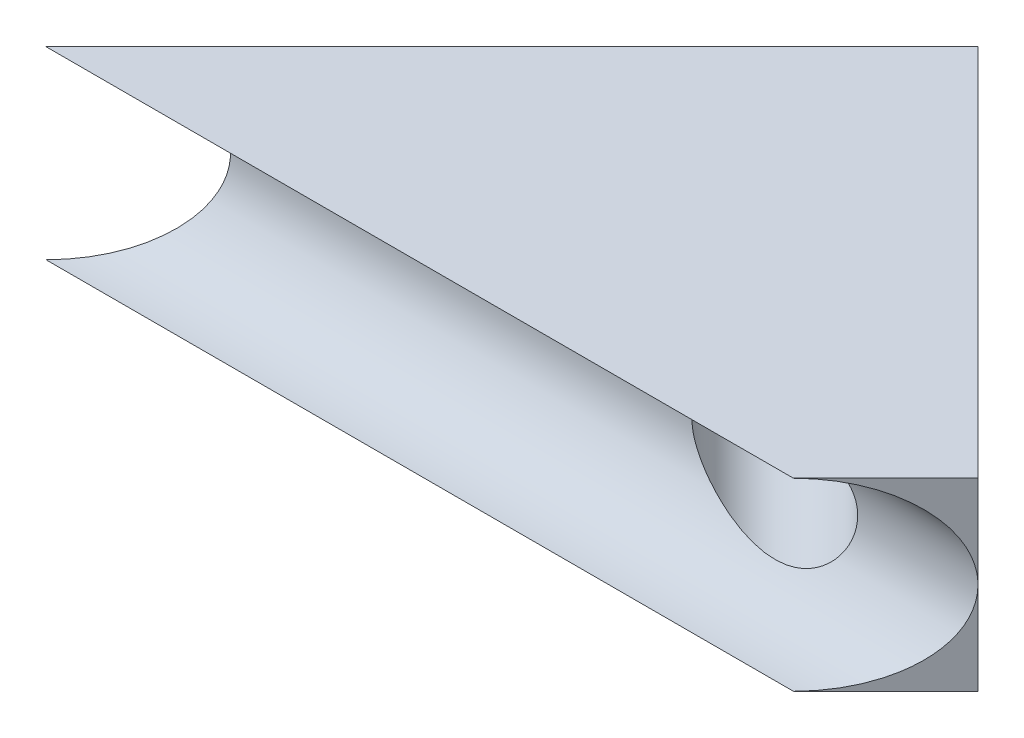
ISO-10303-21;
HEADER;
FILE_DESCRIPTION(('STEP AP214'),'2;1');
FILE_NAME('part.step','',(''),(''),'','','');
FILE_SCHEMA(('AUTOMOTIVE_DESIGN { 1 0 10303 214 1 1 1 1 }'));
ENDSEC;
DATA;
#1=APPLICATION_CONTEXT('core data for automotive mechanical design processes');
#2=APPLICATION_PROTOCOL_DEFINITION('international standard','automotive_design',2000,#1);
#3=PRODUCT_CONTEXT('',#1,'mechanical');
#4=PRODUCT('Part','Part','',(#3));
#5=PRODUCT_RELATED_PRODUCT_CATEGORY('part','',(#4));
#6=PRODUCT_DEFINITION_FORMATION('','',#4);
#7=PRODUCT_DEFINITION_CONTEXT('part definition',#1,'design');
#8=PRODUCT_DEFINITION('design','',#6,#7);
#9=PRODUCT_DEFINITION_SHAPE('','',#8);
#10=(LENGTH_UNIT() NAMED_UNIT(*) SI_UNIT(.MILLI.,.METRE.));
#11=(NAMED_UNIT(*) PLANE_ANGLE_UNIT() SI_UNIT($,.RADIAN.));
#12=(NAMED_UNIT(*) SI_UNIT($,.STERADIAN.) SOLID_ANGLE_UNIT());
#13=UNCERTAINTY_MEASURE_WITH_UNIT(LENGTH_MEASURE(1.E-05),#10,'distance_accuracy_value','');
#14=(GEOMETRIC_REPRESENTATION_CONTEXT(3) GLOBAL_UNCERTAINTY_ASSIGNED_CONTEXT((#13)) GLOBAL_UNIT_ASSIGNED_CONTEXT((#10,
#11,#12)) REPRESENTATION_CONTEXT('',''));
#15=CARTESIAN_POINT('',(0.,0.,0.));
#16=DIRECTION('',(0.,0.,1.));
#17=DIRECTION('',(1.,0.,0.));
#18=AXIS2_PLACEMENT_3D('',#15,#16,#17);
#19=CARTESIAN_POINT('',(0.,70.,0.));
#20=DIRECTION('',(0.707106781186549,0.,0.707106781186546));
#21=DIRECTION('',(0.707106781186546,0.,-0.707106781186549));
#22=AXIS2_PLACEMENT_3D('',#19,#20,#21);
#23=PLANE('',#22);
#24=CARTESIAN_POINT('',(138.244525971888,35.,-138.244525971888));
#25=DIRECTION('',(-0.707106781186549,0.,-0.707106781186546));
#26=DIRECTION('',(-0.707106781186546,0.,0.707106781186549));
#27=AXIS2_PLACEMENT_3D('',#24,#25,#26);
#28=CIRCLE('',#27,22.2312266062723);
#29=CARTESIAN_POINT('',(122.524674884498,35.,-122.524674884498));
#30=VERTEX_POINT('',#29);
#31=EDGE_CURVE('E128',#30,#30,#28,.T.);
#32=ORIENTED_EDGE('',*,*,#31,.F.);
#33=EDGE_LOOP('',(#32));
#34=FACE_BOUND('',#33,.T.);
#35=CARTESIAN_POINT('',(0.,35.,0.));
#36=DIRECTION('',(0.707106781186549,0.,0.707106781186546));
#37=DIRECTION('',(-0.707106781186546,0.,0.707106781186549));
#38=AXIS2_PLACEMENT_3D('',#35,#36,#37);
#39=ELLIPSE('',#38,49.4974746830582,35.);
#40=CARTESIAN_POINT('',(0.,70.,0.));
#41=VERTEX_POINT('',#40);
#42=CARTESIAN_POINT('',(0.,0.,0.));
#43=VERTEX_POINT('',#42);
#44=EDGE_CURVE('E79',#41,#43,#39,.F.);
#45=ORIENTED_EDGE('',*,*,#44,.F.);
#46=DIRECTION('',(-0.707106781186546,0.,0.707106781186549));
#47=VECTOR('',#46,1.);
#48=CARTESIAN_POINT('',(0.,70.,0.));
#49=LINE('',#48,#47);
#50=CARTESIAN_POINT('',(176.776695296637,70.,-176.776695296637));
#51=VERTEX_POINT('',#50);
#52=EDGE_CURVE('E113',#51,#41,#49,.T.);
#53=ORIENTED_EDGE('',*,*,#52,.F.);
#54=DIRECTION('',(0.,-1.,0.));
#55=VECTOR('',#54,1.);
#56=CARTESIAN_POINT('',(176.776695296637,70.,-176.776695296637));
#57=LINE('',#56,#55);
#58=CARTESIAN_POINT('',(176.776695296637,0.,-176.776695296637));
#59=VERTEX_POINT('',#58);
#60=EDGE_CURVE('E101',#51,#59,#57,.T.);
#61=ORIENTED_EDGE('',*,*,#60,.T.);
#62=DIRECTION('',(-0.707106781186546,0.,0.707106781186549));
#63=VECTOR('',#62,1.);
#64=CARTESIAN_POINT('',(0.,0.,0.));
#65=LINE('',#64,#63);
#66=EDGE_CURVE('E111',#59,#43,#65,.T.);
#67=ORIENTED_EDGE('',*,*,#66,.T.);
#68=EDGE_LOOP('',(#45,#53,#61,#67));
#69=FACE_BOUND('',#68,.T.);
#70=ADVANCED_FACE('F39',(#34,#69),#23,.F.);
#71=CARTESIAN_POINT('',(176.776695296637,70.,-176.776695296637));
#72=DIRECTION('',(-0.707106781186549,0.,0.707106781186547));
#73=DIRECTION('',(0.707106781186546,0.,0.707106781186549));
#74=AXIS2_PLACEMENT_3D('',#71,#72,#73);
#75=PLANE('',#74);
#76=DIRECTION('',(-0.707106781186547,0.,-0.707106781186549));
#77=VECTOR('',#76,1.);
#78=CARTESIAN_POINT('',(176.776695296637,70.,-176.776695296637));
#79=LINE('',#78,#77);
#80=CARTESIAN_POINT('',(318.553390593273,70.,-35.));
#81=VERTEX_POINT('',#80);
#82=EDGE_CURVE('E66',#81,#51,#79,.T.);
#83=ORIENTED_EDGE('',*,*,#82,.F.);
#84=DIRECTION('',(0.,-1.,0.));
#85=VECTOR('',#84,1.);
#86=CARTESIAN_POINT('',(318.553390593273,164.,-35.));
#87=LINE('',#86,#85);
#88=CARTESIAN_POINT('',(318.553390593273,35.,-35.));
#89=VERTEX_POINT('',#88);
#90=EDGE_CURVE('E86',#81,#89,#87,.T.);
#91=ORIENTED_EDGE('',*,*,#90,.T.);
#92=CARTESIAN_POINT('',(318.553390593273,0.,-35.));
#93=VERTEX_POINT('',#92);
#94=EDGE_CURVE('E100',#89,#93,#87,.T.);
#95=ORIENTED_EDGE('',*,*,#94,.T.);
#96=DIRECTION('',(-0.707106781186547,0.,-0.707106781186549));
#97=VECTOR('',#96,1.);
#98=CARTESIAN_POINT('',(176.776695296637,0.,-176.776695296637));
#99=LINE('',#98,#97);
#100=EDGE_CURVE('E108',#93,#59,#99,.T.);
#101=ORIENTED_EDGE('',*,*,#100,.T.);
#102=ORIENTED_EDGE('',*,*,#60,.F.);
#103=EDGE_LOOP('',(#83,#91,#95,#101,#102));
#104=FACE_BOUND('',#103,.T.);
#105=ADVANCED_FACE('F150',(#104),#75,.F.);
#106=CARTESIAN_POINT('',(0.,70.,0.));
#107=DIRECTION('',(0.,-1.,0.));
#108=DIRECTION('',(0.,0.,-1.));
#109=AXIS2_PLACEMENT_3D('',#106,#107,#108);
#110=PLANE('',#109);
#111=DIRECTION('',(1.,0.,0.));
#112=VECTOR('',#111,1.);
#113=CARTESIAN_POINT('',(0.,70.,0.));
#114=LINE('',#113,#112);
#115=CARTESIAN_POINT('',(283.553390593273,70.,0.));
#116=VERTEX_POINT('',#115);
#117=EDGE_CURVE('E83',#41,#116,#114,.T.);
#118=ORIENTED_EDGE('',*,*,#117,.T.);
#119=DIRECTION('',(0.707106781186548,0.,-0.707106781186547));
#120=VECTOR('',#119,1.);
#121=CARTESIAN_POINT('',(141.776695296636,70.,141.776695296637));
#122=LINE('',#121,#120);
#123=EDGE_CURVE('E125',#116,#81,#122,.T.);
#124=ORIENTED_EDGE('',*,*,#123,.T.);
#125=ORIENTED_EDGE('',*,*,#82,.T.);
#126=ORIENTED_EDGE('',*,*,#52,.T.);
#127=EDGE_LOOP('',(#118,#124,#125,#126));
#128=FACE_BOUND('',#127,.T.);
#129=ADVANCED_FACE('F146',(#128),#110,.F.);
#130=CARTESIAN_POINT('',(0.,0.,0.));
#131=DIRECTION('',(0.,-1.,0.));
#132=DIRECTION('',(0.,0.,-1.));
#133=AXIS2_PLACEMENT_3D('',#130,#131,#132);
#134=PLANE('',#133);
#135=DIRECTION('',(0.707106781186548,0.,-0.707106781186547));
#136=VECTOR('',#135,1.);
#137=CARTESIAN_POINT('',(318.553390593273,0.,-35.));
#138=LINE('',#137,#136);
#139=CARTESIAN_POINT('',(283.553390593273,0.,0.));
#140=VERTEX_POINT('',#139);
#141=EDGE_CURVE('E98',#140,#93,#138,.T.);
#142=ORIENTED_EDGE('',*,*,#141,.F.);
#143=DIRECTION('',(1.,0.,0.));
#144=VECTOR('',#143,1.);
#145=CARTESIAN_POINT('',(0.,0.,0.));
#146=LINE('',#145,#144);
#147=EDGE_CURVE('E106',#43,#140,#146,.T.);
#148=ORIENTED_EDGE('',*,*,#147,.F.);
#149=ORIENTED_EDGE('',*,*,#66,.F.);
#150=ORIENTED_EDGE('',*,*,#100,.F.);
#151=EDGE_LOOP('',(#142,#148,#149,#150));
#152=FACE_BOUND('',#151,.T.);
#153=ADVANCED_FACE('F104',(#152),#134,.T.);
#154=CARTESIAN_POINT('',(402.,35.,0.));
#155=DIRECTION('',(-1.,0.,0.));
#156=DIRECTION('',(0.,0.,1.));
#157=AXIS2_PLACEMENT_3D('',#154,#155,#156);
#158=CYLINDRICAL_SURFACE('',#157,35.);
#159=CARTESIAN_POINT('',(210.049349768997,35.,-35.));
#160=CARTESIAN_POINT('',(210.049350373867,34.6833696475659,-34.9999998020079));
#161=CARTESIAN_POINT('',(210.0632473887,34.3667348472351,-34.9956918297285));
#162=CARTESIAN_POINT('',(210.118431080023,33.7361113067099,-34.9785949282316));
#163=CARTESIAN_POINT('',(210.159717979462,33.4221225880751,-34.9658059299802));
#164=CARTESIAN_POINT('',(210.268576301915,32.7989466943214,-34.932117377598));
#165=CARTESIAN_POINT('',(210.336168620323,32.489763539992,-34.9112113758539));
#166=CARTESIAN_POINT('',(210.495900684337,31.8784423759471,-34.8618700768882));
#167=CARTESIAN_POINT('',(210.588043430153,31.5763052322081,-34.8334338594309));
#168=CARTESIAN_POINT('',(210.820446728159,30.9067052753023,-34.7618271671585));
#169=CARTESIAN_POINT('',(210.96697303938,30.541613562391,-34.7167516184364));
#170=CARTESIAN_POINT('',(211.290621474194,29.8266793146231,-34.6174406534621));
#171=CARTESIAN_POINT('',(211.467751875478,29.4768409375814,-34.5632027590981));
#172=CARTESIAN_POINT('',(212.039255897943,28.4504042761568,-34.3887325843824));
#173=CARTESIAN_POINT('',(212.473475989442,27.7976088767799,-34.2568263893907));
#174=CARTESIAN_POINT('',(213.137062029247,26.9254997243817,-34.0568547215995));
#175=CARTESIAN_POINT('',(213.33502622526,26.6788919388131,-33.9973722772679));
#176=CARTESIAN_POINT('',(213.742076696497,26.1957909691787,-33.8754758620562));
#177=CARTESIAN_POINT('',(213.95116034583,25.9592954206697,-33.8130625837044));
#178=CARTESIAN_POINT('',(214.593304488913,25.2641096200319,-33.622074062538));
#179=CARTESIAN_POINT('',(215.041062845545,24.8199724498888,-33.4898091423661));
#180=CARTESIAN_POINT('',(215.967695395283,23.9665026773153,-33.2184089624481));
#181=CARTESIAN_POINT('',(216.446619361865,23.5572282850803,-33.0792628024185));
#182=CARTESIAN_POINT('',(217.428966122617,22.7706121955723,-32.7965966893681));
#183=CARTESIAN_POINT('',(217.932397993225,22.3932824728243,-32.6530751233959));
#184=CARTESIAN_POINT('',(218.94381195653,21.6783960400617,-32.3678621344342));
#185=CARTESIAN_POINT('',(219.4512198435,21.3399934470485,-32.2262419829456));
#186=CARTESIAN_POINT('',(220.481429652917,20.6881681753811,-31.9421011295509));
#187=CARTESIAN_POINT('',(221.004229446627,20.3747420644392,-31.799580554297));
#188=CARTESIAN_POINT('',(222.063399680441,19.7705148129749,-31.5146699200237));
#189=CARTESIAN_POINT('',(222.599782036479,19.479734519947,-31.3722800977823));
#190=CARTESIAN_POINT('',(223.683858453336,18.9194173710235,-31.0887989738743));
#191=CARTESIAN_POINT('',(224.231552860642,18.6498811670519,-30.9477077121743));
#192=CARTESIAN_POINT('',(225.338596478426,18.1298518984126,-30.6673380605586));
#193=CARTESIAN_POINT('',(225.897977361351,17.8794224948101,-30.528066911765));
#194=CARTESIAN_POINT('',(227.025569869257,17.3974523637755,-30.2527243007438));
#195=CARTESIAN_POINT('',(227.593781374357,17.1659113801887,-30.1166527951422));
#196=CARTESIAN_POINT('',(228.737941362504,16.7209358391713,-29.8486721560645));
#197=CARTESIAN_POINT('',(229.313886717297,16.5074942019816,-29.7167614078612));
#198=CARTESIAN_POINT('',(230.473038260627,16.0979799059214,-29.4579750368998));
#199=CARTESIAN_POINT('',(231.056244539057,15.9019074623343,-29.3310994765612));
#200=CARTESIAN_POINT('',(232.297458357707,15.5049286137122,-29.068972271845));
#201=CARTESIAN_POINT('',(232.956288712625,15.3061041907445,-28.9344585036048));
#202=CARTESIAN_POINT('',(234.281641796318,14.9292966205421,-28.6743659191323));
#203=CARTESIAN_POINT('',(234.948164667665,14.7513138602657,-28.5487872688116));
#204=CARTESIAN_POINT('',(236.288695117439,14.4161723810039,-28.3081016730716));
#205=CARTESIAN_POINT('',(236.962706468064,14.2590247256049,-28.1930003012472));
#206=CARTESIAN_POINT('',(238.317335411199,13.9660925585285,-27.9751327822448));
#207=CARTESIAN_POINT('',(238.997952880478,13.8303076491606,-27.872366405446));
#208=CARTESIAN_POINT('',(240.362449605077,13.5814313574066,-27.6815715822662));
#209=CARTESIAN_POINT('',(241.046303913982,13.4682488925817,-27.5934842308508));
#210=CARTESIAN_POINT('',(242.419446445784,13.2651269694637,-27.4337747934368));
#211=CARTESIAN_POINT('',(243.108735019334,13.1751890239112,-27.3621537790918));
#212=CARTESIAN_POINT('',(244.491238373136,13.0203935938958,-27.2379654311798));
#213=CARTESIAN_POINT('',(245.184449032559,12.9555134705058,-27.1853809014731));
#214=CARTESIAN_POINT('',(246.574100859354,12.8530607071221,-27.1019830407875));
#215=CARTESIAN_POINT('',(247.270541277108,12.8154820213127,-27.0711648897562));
#216=CARTESIAN_POINT('',(248.645018008801,12.7712384577199,-27.0348477222514));
#217=CARTESIAN_POINT('',(249.323005988648,12.7637134834727,-27.0286443001049));
#218=CARTESIAN_POINT('',(250.678350432577,12.780568225541,-27.0425043031947));
#219=CARTESIAN_POINT('',(251.35570694959,12.8049449707093,-27.0625652823119));
#220=CARTESIAN_POINT('',(252.70652611344,12.889537436026,-27.131725106329));
#221=CARTESIAN_POINT('',(253.379990257024,12.9497383062613,-27.1808119193085));
#222=CARTESIAN_POINT('',(254.719204883765,13.1103945919227,-27.3103624035973));
#223=CARTESIAN_POINT('',(255.384955222855,13.2108507579321,-27.3908266599565));
#224=CARTESIAN_POINT('',(256.712569625724,13.4583397733699,-27.5859043960254));
#225=CARTESIAN_POINT('',(257.374252068516,13.6059986169674,-27.7009755365298));
#226=CARTESIAN_POINT('',(258.677506958123,13.951950734466,-27.9647440483084));
#227=CARTESIAN_POINT('',(259.319080136186,14.1502421647705,-28.113440195231));
#228=CARTESIAN_POINT('',(260.573936003996,14.6007491108714,-28.4420129424141));
#229=CARTESIAN_POINT('',(261.187251330726,14.8529004204068,-28.6218523689336));
#230=CARTESIAN_POINT('',(262.378901948119,15.4132377446058,-29.008176468058));
#231=CARTESIAN_POINT('',(262.957242654088,15.7214150547128,-29.2146570000863));
#232=CARTESIAN_POINT('',(263.998126399863,16.3490157460599,-29.6185875460773));
#233=CARTESIAN_POINT('',(264.465836410385,16.6614826277785,-29.8135815449537));
#234=CARTESIAN_POINT('',(265.366727289527,17.3273835455543,-30.2130645429449));
#235=CARTESIAN_POINT('',(265.799910784512,17.6808144605287,-30.4175528179723));
#236=CARTESIAN_POINT('',(266.62958825831,18.4268150180143,-30.8303632315601));
#237=CARTESIAN_POINT('',(267.02606233175,18.8194056576615,-31.0386873775414));
#238=CARTESIAN_POINT('',(267.780619186346,19.6408638715716,-31.4532753205129));
#239=CARTESIAN_POINT('',(268.138701924299,20.0697314866561,-31.6595391151845));
#240=CARTESIAN_POINT('',(268.794847390966,20.9330250005614,-32.0520043906438));
#241=CARTESIAN_POINT('',(269.095251193243,21.3654715244197,-32.2386581437666));
#242=CARTESIAN_POINT('',(269.661506544145,22.2566416521582,-32.6011990949323));
#243=CARTESIAN_POINT('',(269.927360216772,22.7153636382296,-32.7770869544667));
#244=CARTESIAN_POINT('',(270.424641090862,23.6561097813981,-33.1144355020825));
#245=CARTESIAN_POINT('',(270.656070826409,24.1381322197908,-33.275897251778));
#246=CARTESIAN_POINT('',(271.084812730781,25.122498659848,-33.5812532146729));
#247=CARTESIAN_POINT('',(271.282122985449,25.6248437996994,-33.7251464421168));
#248=CARTESIAN_POINT('',(271.655303254382,26.6817760991256,-34.0018466933105));
#249=CARTESIAN_POINT('',(271.828780330286,27.2375852368121,-34.1332201121698));
#250=CARTESIAN_POINT('',(272.137539246383,28.3650848794777,-34.3701877754906));
#251=CARTESIAN_POINT('',(272.272819679726,28.9367759685658,-34.4757810704051));
#252=CARTESIAN_POINT('',(272.505545059727,30.0923239402187,-34.6591547522381));
#253=CARTESIAN_POINT('',(272.602981834814,30.6761834216559,-34.7369291319392));
#254=CARTESIAN_POINT('',(272.760233707995,31.8520790378631,-34.8631652510926));
#255=CARTESIAN_POINT('',(272.820048325164,32.4441152770579,-34.9116266158362));
#256=CARTESIAN_POINT('',(272.903695548342,33.6538908469834,-34.9795380599531));
#257=CARTESIAN_POINT('',(272.926154822561,34.2717880168929,-34.9978805563332));
#258=CARTESIAN_POINT('',(272.930928007122,35.5078515605528,-35.0017725948474));
#259=CARTESIAN_POINT('',(272.913240817866,36.1260179412133,-34.987321238769));
#260=CARTESIAN_POINT('',(272.837664566778,37.3583238377715,-34.925906138952));
#261=CARTESIAN_POINT('',(272.779771880822,37.9724629856165,-34.8789394642839));
#262=CARTESIAN_POINT('',(272.623613935815,39.1923230786641,-34.753422556928));
#263=CARTESIAN_POINT('',(272.525348800756,39.7980440497151,-34.6748724212408));
#264=CARTESIAN_POINT('',(272.287529956143,40.999992108236,-34.4872734794217));
#265=CARTESIAN_POINT('',(272.147757141969,41.5961506594733,-34.3780629994204));
#266=CARTESIAN_POINT('',(271.826740488161,42.7712787310921,-34.131622248047));
#267=CARTESIAN_POINT('',(271.645496207719,43.3502480686925,-33.9943916788459));
#268=CARTESIAN_POINT('',(271.241067165873,44.4867610374767,-33.6949066361897));
#269=CARTESIAN_POINT('',(271.017877603631,45.0443022072971,-33.5326492986827));
#270=CARTESIAN_POINT('',(270.529121283667,46.1336368182042,-33.1868748200704));
#271=CARTESIAN_POINT('',(270.263555285213,46.6654307203869,-33.0033580598904));
#272=CARTESIAN_POINT('',(269.694010776572,47.6913359416001,-32.6224599211239));
#273=CARTESIAN_POINT('',(269.390669391356,48.185893400468,-32.4253282980175));
#274=CARTESIAN_POINT('',(268.742450094277,49.1421295423494,-32.0198356946149));
#275=CARTESIAN_POINT('',(268.397572486817,49.6038084662782,-31.8114747966201));
#276=CARTESIAN_POINT('',(267.666947234361,50.4902978913054,-31.3893540160427));
#277=CARTESIAN_POINT('',(267.281231545522,50.9151367533893,-31.1755984531487));
#278=CARTESIAN_POINT('',(266.469815124136,51.7250718031545,-30.7486842267437));
#279=CARTESIAN_POINT('',(266.04411735621,52.1101709330505,-30.5355255201815));
#280=CARTESIAN_POINT('',(265.181250080118,52.816353325792,-30.128619666725));
#281=CARTESIAN_POINT('',(264.746268597917,53.1398817111791,-29.9344720120887));
#282=CARTESIAN_POINT('',(263.845341826349,53.7479947984659,-29.557414549613));
#283=CARTESIAN_POINT('',(263.379398304519,54.0325817205926,-29.3745041014182));
#284=CARTESIAN_POINT('',(262.420043966279,54.5621629755466,-29.0245171387066));
#285=CARTESIAN_POINT('',(261.926638634765,54.8071651766759,-28.8574374802224));
#286=CARTESIAN_POINT('',(260.916322282248,55.2580117438007,-28.5427506595494));
#287=CARTESIAN_POINT('',(260.39941096666,55.4638556188851,-28.3951437414892));
#288=CARTESIAN_POINT('',(259.364668276087,55.8312196108658,-28.1266823482778));
#289=CARTESIAN_POINT('',(258.847483660719,55.9940236973274,-28.0050807099211));
#290=CARTESIAN_POINT('',(257.799267418638,56.2861658492234,-27.7836777628386));
#291=CARTESIAN_POINT('',(257.268236339339,56.4155052354652,-27.6838755937408));
#292=CARTESIAN_POINT('',(256.195908527911,56.6430219226865,-27.5063702742283));
#293=CARTESIAN_POINT('',(255.654610548092,56.7411954101632,-27.4286698283321));
#294=CARTESIAN_POINT('',(254.564930338125,56.9088770293788,-27.2949190162422));
#295=CARTESIAN_POINT('',(254.016547203107,56.9783814616129,-27.2388714442321));
#296=CARTESIAN_POINT('',(252.996045981255,57.0829665221437,-27.154122174171));
#297=CARTESIAN_POINT('',(252.524511144688,57.1215962709543,-27.1226189572221));
#298=CARTESIAN_POINT('',(251.579548466142,57.1812906860269,-27.0738219524774));
#299=CARTESIAN_POINT('',(251.106120363628,57.2023528449264,-27.0565301930398));
#300=CARTESIAN_POINT('',(250.158292299749,57.2282914743811,-27.0352237576138));
#301=CARTESIAN_POINT('',(249.683891950249,57.2331591497363,-27.0312162963121));
#302=CARTESIAN_POINT('',(248.735265949597,57.2279317932504,-27.03551462171));
#303=CARTESIAN_POINT('',(248.261040293032,57.2178372723967,-27.0438199879032));
#304=CARTESIAN_POINT('',(247.311290904125,57.1837085178223,-27.0718222182128));
#305=CARTESIAN_POINT('',(246.835771028868,57.1596113174357,-27.0915705373752));
#306=CARTESIAN_POINT('',(245.886137202439,57.0983925112214,-27.1415291076225));
#307=CARTESIAN_POINT('',(245.412023249593,57.0612709209238,-27.1717393462328));
#308=CARTESIAN_POINT('',(244.465720117777,56.9748322762365,-27.2416929591906));
#309=CARTESIAN_POINT('',(243.993530570831,56.9255176764139,-27.2814344147666));
#310=CARTESIAN_POINT('',(243.051301116891,56.8153696049135,-27.3695928385478));
#311=CARTESIAN_POINT('',(242.581261332629,56.7545354837841,-27.4180102958834));
#312=CARTESIAN_POINT('',(241.308618874024,56.5745431038931,-27.5601184648994));
#313=CARTESIAN_POINT('',(240.508345802117,56.4447674814923,-27.6614403198276));
#314=CARTESIAN_POINT('',(238.915952195011,56.1551321470651,-27.8835734231869));
#315=CARTESIAN_POINT('',(238.123832856205,55.9952680847159,-28.0043874895289));
#316=CARTESIAN_POINT('',(236.547986762729,55.6465551624384,-28.262463823698));
#317=CARTESIAN_POINT('',(235.764267854753,55.4576813666677,-28.3997402195502));
#318=CARTESIAN_POINT('',(234.206798573318,55.0516017000557,-28.6878940407833));
#319=CARTESIAN_POINT('',(233.433047637443,54.8343974354454,-28.838770694931));
#320=CARTESIAN_POINT('',(231.898619929975,54.3722104311873,-29.1512448259484));
#321=CARTESIAN_POINT('',(231.137911755194,54.1273100600989,-29.3128099498316));
#322=CARTESIAN_POINT('',(229.628363768748,53.6084934329848,-29.6448794108907));
#323=CARTESIAN_POINT('',(228.87952473251,53.3345752900945,-29.8153843290072));
#324=CARTESIAN_POINT('',(227.395971712934,52.756693339643,-30.1631145580123));
#325=CARTESIAN_POINT('',(226.66124477423,52.4527588343468,-30.3403332126955));
#326=CARTESIAN_POINT('',(225.207262917266,51.8127080625555,-30.6996354829828));
#327=CARTESIAN_POINT('',(224.488005070569,51.476597954044,-30.8817181628868));
#328=CARTESIAN_POINT('',(223.245228551572,50.8578947944515,-31.2028255041629));
#329=CARTESIAN_POINT('',(222.717742886524,50.5829392733534,-31.3412303497039));
#330=CARTESIAN_POINT('',(221.67448883539,50.0119402116204,-31.6187041272892));
#331=CARTESIAN_POINT('',(221.158719759939,49.7158979159222,-31.7577730196774));
#332=CARTESIAN_POINT('',(220.140408576588,49.1007181002847,-32.0356642720495));
#333=CARTESIAN_POINT('',(219.637877876054,48.7815614970401,-32.1744863291064));
#334=CARTESIAN_POINT('',(218.649058867536,48.1182905570421,-32.4505704174966));
#335=CARTESIAN_POINT('',(218.162770370714,47.7741765106019,-32.587832466955));
#336=CARTESIAN_POINT('',(217.205377804039,47.0552211552653,-32.8606283644658));
#337=CARTESIAN_POINT('',(216.734457033804,46.6801238197967,-32.9961342639704));
#338=CARTESIAN_POINT('',(215.81712044304,45.8990480882327,-33.2623066778325));
#339=CARTESIAN_POINT('',(215.370710582611,45.4930622380065,-33.3929720126625));
#340=CARTESIAN_POINT('',(214.509714807597,44.6480992584275,-33.6468192617709));
#341=CARTESIAN_POINT('',(214.095063667579,44.2091936227797,-33.7700163992346));
#342=CARTESIAN_POINT('',(213.305128496995,43.2947940207975,-34.0061624318249));
#343=CARTESIAN_POINT('',(212.929814403751,42.8193284837101,-34.1191191439762));
#344=CARTESIAN_POINT('',(212.380000165195,42.0421996988666,-34.2854298261102));
#345=CARTESIAN_POINT('',(212.188462222845,41.7535542034266,-34.3435529445754));
#346=CARTESIAN_POINT('',(211.824280268683,41.1634237225066,-34.4543516838657));
#347=CARTESIAN_POINT('',(211.651639213583,40.8619367379975,-34.5070264521407));
#348=CARTESIAN_POINT('',(211.328263418369,40.2467090884394,-34.6059100222031));
#349=CARTESIAN_POINT('',(211.17750923416,39.9329796178553,-34.6521245618251));
#350=CARTESIAN_POINT('',(210.900811783305,39.2939051997998,-34.7371008025017));
#351=CARTESIAN_POINT('',(210.774855082656,38.9685666550067,-34.7758665386611));
#352=CARTESIAN_POINT('',(210.563878403541,38.3464113212799,-34.8408887763749));
#353=CARTESIAN_POINT('',(210.47578720949,38.0507355251767,-34.8680799456562));
#354=CARTESIAN_POINT('',(210.323150756434,37.4527846882336,-34.9152365796308));
#355=CARTESIAN_POINT('',(210.258603395124,37.1505102391647,-34.9352026894719));
#356=CARTESIAN_POINT('',(210.154669892133,36.5414298929549,-34.9673693527807));
#357=CARTESIAN_POINT('',(210.115267722717,36.2346270101426,-34.9795748529016));
#358=CARTESIAN_POINT('',(210.062607085682,35.6185508679815,-34.9958903599284));
#359=CARTESIAN_POINT('',(210.049349178173,35.3092775558492,-35.0000001933943));
#360=CARTESIAN_POINT('',(210.049349768997,35.,-35.));
#361=B_SPLINE_CURVE_WITH_KNOTS('',3,(#159,#160,#161,#162,#163,#164,#165,#166,#167,#168,#169,
#170,#171,#172,#173,#174,#175,#176,#177,#178,#179,#180,#181,#182,#183,#184,#185,#186,#187,#188,
#189,#190,#191,#192,#193,#194,#195,#196,#197,#198,#199,#200,#201,#202,#203,#204,#205,#206,#207,
#208,#209,#210,#211,#212,#213,#214,#215,#216,#217,#218,#219,#220,#221,#222,#223,#224,#225,#226,
#227,#228,#229,#230,#231,#232,#233,#234,#235,#236,#237,#238,#239,#240,#241,#242,#243,#244,#245,
#246,#247,#248,#249,#250,#251,#252,#253,#254,#255,#256,#257,#258,#259,#260,#261,#262,#263,#264,
#265,#266,#267,#268,#269,#270,#271,#272,#273,#274,#275,#276,#277,#278,#279,#280,#281,#282,#283,
#284,#285,#286,#287,#288,#289,#290,#291,#292,#293,#294,#295,#296,#297,#298,#299,#300,#301,#302,
#303,#304,#305,#306,#307,#308,#309,#310,#311,#312,#313,#314,#315,#316,#317,#318,#319,#320,#321,
#322,#323,#324,#325,#326,#327,#328,#329,#330,#331,#332,#333,#334,#335,#336,#337,#338,#339,#340,
#341,#342,#343,#344,#345,#346,#347,#348,#349,#350,#351,#352,#353,#354,#355,#356,#357,#358,#359,
#360),.UNSPECIFIED.,.T.,.F.,(4,2,2,2,2,2,2,2,2,2,2,2,2,2,2,2,2,2,2,2,2,2,2,2,2,2,2,2,2,2,2,2,2,
2,2,2,2,2,2,2,2,2,2,2,2,2,2,2,2,2,2,2,2,2,2,2,2,2,2,2,2,2,2,2,2,2,2,2,2,2,2,2,2,2,2,2,2,2,2,2,2,
2,2,2,2,2,2,2,2,2,2,2,2,2,2,2,2,2,2,2,4),(0.,0.949569588031101,1.89914690547112,
2.84948005289911,3.79992939013647,4.98596894249319,6.1723297944651,8.54735189725422,
9.51255351439253,10.4775281999947,12.4084471705024,14.3425294481986,16.2773335398179,
18.1549557840555,20.0323195574174,21.9113916689455,23.7905214217257,25.6756610389954,
27.5607750867444,29.4451483167578,31.3295448994642,33.4327339719324,35.5359620872316,
37.6403025961689,39.7446039258909,41.8402462651516,43.9360249533489,46.0299057194564,
48.1233226609397,50.1563801574324,52.1892483198199,54.2212743986254,56.2533383674979,
58.3135546286398,60.3736958853897,62.4313948228296,64.4887743358384,66.2723144650581,
68.0557187941285,69.8400845640716,71.6244523419473,73.2986094373964,74.9726635637318,
76.6465943951714,78.3206191063904,80.109261070936,81.8979689057398,83.6870627613135,
85.4761794864231,87.3297248249396,89.1833209320551,91.0370841440069,92.8908416626412,
94.7545639329931,96.6183060141104,98.4822615394797,100.346183671758,102.182099357828,
104.018001589966,105.852477684104,107.686817861359,109.412062609495,111.137208952691,
112.862011963512,114.586836596023,116.252165911495,117.917429488585,119.582896751173,
121.248578861371,122.670504346794,124.092632744104,125.515533371256,126.938385404765,
128.367685723413,129.796984337788,131.225995454888,132.655087161277,135.105204457026,
137.555676274319,140.008266350443,142.46071743432,144.906057736526,147.351557143349,
149.79469239455,152.237360993342,154.069151098167,155.900833145909,157.734045069689,
159.567235672376,161.417476865937,163.268165991533,165.114946184108,166.960304553905,
168.013423068333,169.066706124744,170.119047651865,171.170817495986,172.098991353695,
173.027082311439,173.954581104546,174.882099767989),.UNSPECIFIED.);
#362=CARTESIAN_POINT('',(210.049349768997,35.,-35.));
#363=VERTEX_POINT('',#362);
#364=EDGE_CURVE('E42',#363,#363,#361,.T.);
#365=ORIENTED_EDGE('',*,*,#364,.F.);
#366=EDGE_LOOP('',(#365));
#367=FACE_BOUND('',#366,.T.);
#368=CARTESIAN_POINT('',(283.553390593273,35.,0.));
#369=DIRECTION('',(-0.707106781186547,0.,-0.707106781186548));
#370=DIRECTION('',(-0.707106781186548,0.,0.707106781186547));
#371=AXIS2_PLACEMENT_3D('',#368,#369,#370);
#372=ELLIPSE('',#371,49.4974746830584,35.);
#373=EDGE_CURVE('E11',#116,#89,#372,.T.);
#374=ORIENTED_EDGE('',*,*,#373,.F.);
#375=ORIENTED_EDGE('',*,*,#117,.F.);
#376=ORIENTED_EDGE('',*,*,#44,.T.);
#377=ORIENTED_EDGE('',*,*,#147,.T.);
#378=EDGE_CURVE('E52',#89,#140,#372,.T.);
#379=ORIENTED_EDGE('',*,*,#378,.F.);
#380=EDGE_LOOP('',(#374,#375,#376,#377,#379));
#381=FACE_BOUND('',#380,.T.);
#382=ADVANCED_FACE('F110',(#367,#381),#158,.F.);
#383=CARTESIAN_POINT('',(318.553390593273,164.,-35.));
#384=DIRECTION('',(-0.707106781186547,0.,-0.707106781186548));
#385=DIRECTION('',(-0.707106781186548,0.,0.707106781186547));
#386=AXIS2_PLACEMENT_3D('',#383,#384,#385);
#387=PLANE('',#386);
#388=ORIENTED_EDGE('',*,*,#378,.T.);
#389=ORIENTED_EDGE('',*,*,#141,.T.);
#390=ORIENTED_EDGE('',*,*,#94,.F.);
#391=EDGE_LOOP('',(#388,#389,#390));
#392=FACE_BOUND('',#391,.T.);
#393=ADVANCED_FACE('F97',(#392),#387,.F.);
#394=ORIENTED_EDGE('',*,*,#373,.T.);
#395=ORIENTED_EDGE('',*,*,#90,.F.);
#396=ORIENTED_EDGE('',*,*,#123,.F.);
#397=EDGE_LOOP('',(#394,#395,#396));
#398=FACE_BOUND('',#397,.T.);
#399=ADVANCED_FACE('F143',(#398),#387,.F.);
#400=CARTESIAN_POINT('',(315.728328049712,35.,39.2392761059348));
#401=DIRECTION('',(-0.707106781186549,0.,-0.707106781186546));
#402=DIRECTION('',(-0.707106781186546,0.,0.707106781186549));
#403=AXIS2_PLACEMENT_3D('',#400,#401,#402);
#404=CYLINDRICAL_SURFACE('',#403,22.2312266062723);
#405=ORIENTED_EDGE('',*,*,#364,.T.);
#406=EDGE_LOOP('',(#405));
#407=FACE_BOUND('',#406,.T.);
#408=ORIENTED_EDGE('',*,*,#31,.T.);
#409=EDGE_LOOP('',(#408));
#410=FACE_BOUND('',#409,.T.);
#411=ADVANCED_FACE('F135',(#407,#410),#404,.F.);
#412=CLOSED_SHELL('',(#70,#105,#129,#153,#382,#393,#399,#411));
#413=MANIFOLD_SOLID_BREP('B2',#412);
#414=ADVANCED_BREP_SHAPE_REPRESENTATION('',(#18,#413),#14);
#415=SHAPE_DEFINITION_REPRESENTATION(#9,#414);
ENDSEC;
END-ISO-10303-21;
